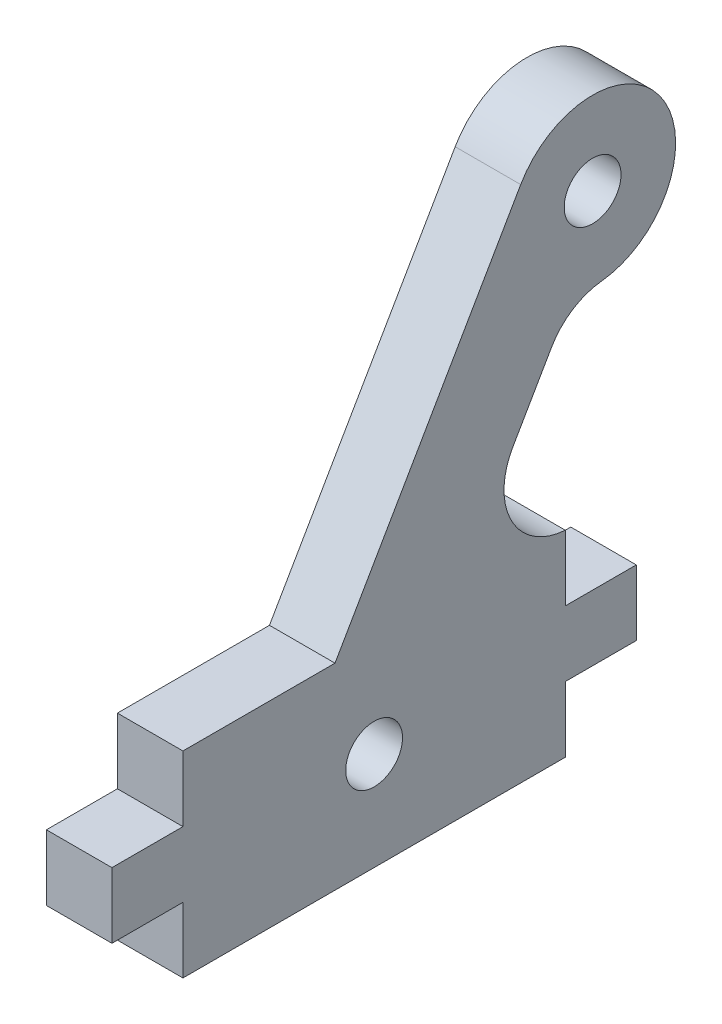
ISO-10303-21;
HEADER;
FILE_DESCRIPTION(('STEP AP214'),'2;1');
FILE_NAME('part.step','',(''),(''),'','','');
FILE_SCHEMA(('AUTOMOTIVE_DESIGN { 1 0 10303 214 1 1 1 1 }'));
ENDSEC;
DATA;
#1=APPLICATION_CONTEXT('core data for automotive mechanical design processes');
#2=APPLICATION_PROTOCOL_DEFINITION('international standard','automotive_design',2000,#1);
#3=PRODUCT_CONTEXT('',#1,'mechanical');
#4=PRODUCT('Part','Part','',(#3));
#5=PRODUCT_RELATED_PRODUCT_CATEGORY('part','',(#4));
#6=PRODUCT_DEFINITION_FORMATION('','',#4);
#7=PRODUCT_DEFINITION_CONTEXT('part definition',#1,'design');
#8=PRODUCT_DEFINITION('design','',#6,#7);
#9=PRODUCT_DEFINITION_SHAPE('','',#8);
#10=(LENGTH_UNIT() NAMED_UNIT(*) SI_UNIT(.MILLI.,.METRE.));
#11=(NAMED_UNIT(*) PLANE_ANGLE_UNIT() SI_UNIT($,.RADIAN.));
#12=(NAMED_UNIT(*) SI_UNIT($,.STERADIAN.) SOLID_ANGLE_UNIT());
#13=UNCERTAINTY_MEASURE_WITH_UNIT(LENGTH_MEASURE(1.E-05),#10,'distance_accuracy_value','');
#14=(GEOMETRIC_REPRESENTATION_CONTEXT(3) GLOBAL_UNCERTAINTY_ASSIGNED_CONTEXT((#13)) GLOBAL_UNIT_ASSIGNED_CONTEXT((#10,
#11,#12)) REPRESENTATION_CONTEXT('',''));
#15=CARTESIAN_POINT('',(0.,0.,0.));
#16=DIRECTION('',(0.,0.,1.));
#17=DIRECTION('',(1.,0.,0.));
#18=AXIS2_PLACEMENT_3D('',#15,#16,#17);
#19=CARTESIAN_POINT('',(3.,-0.499999999999998,-0.866025403784441));
#20=DIRECTION('',(0.,-0.499999999999998,-0.86602540378444));
#21=DIRECTION('',(0.,0.86602540378444,-0.499999999999998));
#22=AXIS2_PLACEMENT_3D('',#19,#20,#21);
#23=PLANE('',#22);
#24=DIRECTION('',(0.,-0.86602540378444,0.499999999999998));
#25=VECTOR('',#24,1.);
#26=CARTESIAN_POINT('',(0.,-0.499999999999998,-0.866025403784441));
#27=LINE('',#26,#25);
#28=CARTESIAN_POINT('',(0.,12.0581557157725,-8.1164799868109));
#29=VERTEX_POINT('',#28);
#30=CARTESIAN_POINT('',(0.,8.99363906105745,-6.34718047127507));
#31=VERTEX_POINT('',#30);
#32=EDGE_CURVE('E211',#29,#31,#27,.T.);
#33=ORIENTED_EDGE('',*,*,#32,.F.);
#34=DIRECTION('',(-1.,0.,0.));
#35=VECTOR('',#34,1.);
#36=CARTESIAN_POINT('',(3.,12.0581557157725,-8.1164799868109));
#37=LINE('',#36,#35);
#38=CARTESIAN_POINT('',(3.,12.0581557157725,-8.1164799868109));
#39=VERTEX_POINT('',#38);
#40=EDGE_CURVE('E56',#29,#39,#37,.F.);
#41=ORIENTED_EDGE('',*,*,#40,.T.);
#42=DIRECTION('',(0.,-0.86602540378444,0.499999999999998));
#43=VECTOR('',#42,1.);
#44=CARTESIAN_POINT('',(3.,-0.499999999999998,-0.866025403784441));
#45=LINE('',#44,#43);
#46=CARTESIAN_POINT('',(3.,8.99363906105745,-6.34718047127507));
#47=VERTEX_POINT('',#46);
#48=EDGE_CURVE('E165',#39,#47,#45,.T.);
#49=ORIENTED_EDGE('',*,*,#48,.T.);
#50=DIRECTION('',(1.,0.,0.));
#51=VECTOR('',#50,1.);
#52=CARTESIAN_POINT('',(0.,8.99363906105745,-6.34718047127507));
#53=LINE('',#52,#51);
#54=EDGE_CURVE('E277',#47,#31,#53,.F.);
#55=ORIENTED_EDGE('',*,*,#54,.T.);
#56=EDGE_LOOP('',(#33,#41,#49,#55));
#57=FACE_BOUND('',#56,.T.);
#58=ADVANCED_FACE('F36',(#57),#23,.T.);
#59=CARTESIAN_POINT('',(3.,17.3205080756888,-9.99999999999996));
#60=DIRECTION('',(-1.,0.,0.));
#61=DIRECTION('',(0.,0.,1.));
#62=AXIS2_PLACEMENT_3D('',#59,#60,#61);
#63=CYLINDRICAL_SURFACE('',#62,3.8);
#64=CARTESIAN_POINT('',(3.,17.3205080756888,-9.99999999999996));
#65=DIRECTION('',(1.,0.,0.));
#66=DIRECTION('',(0.,0.,-1.));
#67=AXIS2_PLACEMENT_3D('',#64,#65,#66);
#68=CIRCLE('',#67,3.8);
#69=CARTESIAN_POINT('',(3.,13.5415464627944,-10.3993108166212));
#70=VERTEX_POINT('',#69);
#71=CARTESIAN_POINT('',(3.,19.2205080756888,-6.70910346561908));
#72=VERTEX_POINT('',#71);
#73=EDGE_CURVE('E153',#70,#72,#68,.T.);
#74=ORIENTED_EDGE('',*,*,#73,.F.);
#75=DIRECTION('',(-1.,0.,0.));
#76=VECTOR('',#75,1.);
#77=CARTESIAN_POINT('',(3.,13.5415464627944,-10.3993108166212));
#78=LINE('',#77,#76);
#79=CARTESIAN_POINT('',(0.,13.5415464627944,-10.3993108166212));
#80=VERTEX_POINT('',#79);
#81=EDGE_CURVE('E175',#70,#80,#78,.T.);
#82=ORIENTED_EDGE('',*,*,#81,.T.);
#83=CARTESIAN_POINT('',(0.,17.3205080756888,-9.99999999999996));
#84=DIRECTION('',(1.,0.,0.));
#85=DIRECTION('',(0.,0.,-1.));
#86=AXIS2_PLACEMENT_3D('',#83,#84,#85);
#87=CIRCLE('',#86,3.8);
#88=CARTESIAN_POINT('',(0.,19.2205080756888,-6.70910346561908));
#89=VERTEX_POINT('',#88);
#90=EDGE_CURVE('E171',#80,#89,#87,.T.);
#91=ORIENTED_EDGE('',*,*,#90,.T.);
#92=DIRECTION('',(-1.,0.,0.));
#93=VECTOR('',#92,1.);
#94=CARTESIAN_POINT('',(3.,19.2205080756888,-6.70910346561908));
#95=LINE('',#94,#93);
#96=EDGE_CURVE('E168',#72,#89,#95,.T.);
#97=ORIENTED_EDGE('',*,*,#96,.F.);
#98=EDGE_LOOP('',(#74,#82,#91,#97));
#99=FACE_BOUND('',#98,.T.);
#100=ADVANCED_FACE('F169',(#99),#63,.T.);
#101=CARTESIAN_POINT('',(3.,1.89999999999999,3.29089653438087));
#102=DIRECTION('',(0.,-0.499999999999997,-0.86602540378444));
#103=DIRECTION('',(0.,0.86602540378444,-0.499999999999998));
#104=AXIS2_PLACEMENT_3D('',#101,#102,#103);
#105=PLANE('',#104);
#106=DIRECTION('',(0.,-0.86602540378444,0.499999999999998));
#107=VECTOR('',#106,1.);
#108=CARTESIAN_POINT('',(0.,1.89999999999999,3.29089653438087));
#109=LINE('',#108,#107);
#110=CARTESIAN_POINT('',(0.,4.5,1.78978583448785));
#111=VERTEX_POINT('',#110);
#112=EDGE_CURVE('E216',#89,#111,#109,.T.);
#113=ORIENTED_EDGE('',*,*,#112,.T.);
#114=DIRECTION('',(-1.,0.,0.));
#115=VECTOR('',#114,1.);
#116=CARTESIAN_POINT('',(3.,4.5,1.78978583448785));
#117=LINE('',#116,#115);
#118=CARTESIAN_POINT('',(3.,4.5,1.78978583448785));
#119=VERTEX_POINT('',#118);
#120=EDGE_CURVE('E176',#119,#111,#117,.T.);
#121=ORIENTED_EDGE('',*,*,#120,.F.);
#122=DIRECTION('',(0.,-0.86602540378444,0.499999999999998));
#123=VECTOR('',#122,1.);
#124=CARTESIAN_POINT('',(3.,1.89999999999999,3.29089653438087));
#125=LINE('',#124,#123);
#126=EDGE_CURVE('E158',#72,#119,#125,.T.);
#127=ORIENTED_EDGE('',*,*,#126,.F.);
#128=ORIENTED_EDGE('',*,*,#96,.T.);
#129=EDGE_LOOP('',(#113,#121,#127,#128));
#130=FACE_BOUND('',#129,.T.);
#131=ADVANCED_FACE('F178',(#130),#105,.F.);
#132=CARTESIAN_POINT('',(3.,4.5,0.));
#133=DIRECTION('',(0.,1.,0.));
#134=DIRECTION('',(0.,0.,1.));
#135=AXIS2_PLACEMENT_3D('',#132,#133,#134);
#136=PLANE('',#135);
#137=DIRECTION('',(0.,0.,-1.));
#138=VECTOR('',#137,1.);
#139=CARTESIAN_POINT('',(0.,4.5,0.));
#140=LINE('',#139,#138);
#141=CARTESIAN_POINT('',(0.,4.5,8.75));
#142=VERTEX_POINT('',#141);
#143=EDGE_CURVE('E218',#142,#111,#140,.T.);
#144=ORIENTED_EDGE('',*,*,#143,.F.);
#145=DIRECTION('',(-1.,0.,0.));
#146=VECTOR('',#145,1.);
#147=CARTESIAN_POINT('',(3.,4.5,8.75));
#148=LINE('',#147,#146);
#149=CARTESIAN_POINT('',(3.,4.5,8.75));
#150=VERTEX_POINT('',#149);
#151=EDGE_CURVE('E273',#150,#142,#148,.T.);
#152=ORIENTED_EDGE('',*,*,#151,.F.);
#153=DIRECTION('',(0.,0.,-1.));
#154=VECTOR('',#153,1.);
#155=CARTESIAN_POINT('',(3.,4.5,0.));
#156=LINE('',#155,#154);
#157=EDGE_CURVE('E180',#150,#119,#156,.T.);
#158=ORIENTED_EDGE('',*,*,#157,.T.);
#159=ORIENTED_EDGE('',*,*,#120,.T.);
#160=EDGE_LOOP('',(#144,#152,#158,#159));
#161=FACE_BOUND('',#160,.T.);
#162=ADVANCED_FACE('F341',(#161),#136,.T.);
#163=CARTESIAN_POINT('',(3.,0.,8.75));
#164=DIRECTION('',(0.,0.,1.));
#165=DIRECTION('',(1.,0.,0.));
#166=AXIS2_PLACEMENT_3D('',#163,#164,#165);
#167=PLANE('',#166);
#168=DIRECTION('',(0.,1.,0.));
#169=VECTOR('',#168,1.);
#170=CARTESIAN_POINT('',(0.,0.,8.75));
#171=LINE('',#170,#169);
#172=CARTESIAN_POINT('',(0.,1.5,8.75));
#173=VERTEX_POINT('',#172);
#174=EDGE_CURVE('E221',#173,#142,#171,.T.);
#175=ORIENTED_EDGE('',*,*,#174,.F.);
#176=DIRECTION('',(-1.,0.,0.));
#177=VECTOR('',#176,1.);
#178=CARTESIAN_POINT('',(3.,1.5,8.75));
#179=LINE('',#178,#177);
#180=CARTESIAN_POINT('',(3.,1.5,8.75));
#181=VERTEX_POINT('',#180);
#182=EDGE_CURVE('E271',#181,#173,#179,.T.);
#183=ORIENTED_EDGE('',*,*,#182,.F.);
#184=DIRECTION('',(0.,1.,0.));
#185=VECTOR('',#184,1.);
#186=CARTESIAN_POINT('',(3.,0.,8.75));
#187=LINE('',#186,#185);
#188=EDGE_CURVE('E182',#181,#150,#187,.T.);
#189=ORIENTED_EDGE('',*,*,#188,.T.);
#190=ORIENTED_EDGE('',*,*,#151,.T.);
#191=EDGE_LOOP('',(#175,#183,#189,#190));
#192=FACE_BOUND('',#191,.T.);
#193=ADVANCED_FACE('F345',(#192),#167,.T.);
#194=CARTESIAN_POINT('',(3.,1.5,0.));
#195=DIRECTION('',(0.,1.,0.));
#196=DIRECTION('',(0.,0.,1.));
#197=AXIS2_PLACEMENT_3D('',#194,#195,#196);
#198=PLANE('',#197);
#199=DIRECTION('',(0.,0.,-1.));
#200=VECTOR('',#199,1.);
#201=CARTESIAN_POINT('',(0.,1.5,0.));
#202=LINE('',#201,#200);
#203=CARTESIAN_POINT('',(0.,1.5,12.));
#204=VERTEX_POINT('',#203);
#205=EDGE_CURVE('E224',#204,#173,#202,.T.);
#206=ORIENTED_EDGE('',*,*,#205,.F.);
#207=DIRECTION('',(-1.,0.,0.));
#208=VECTOR('',#207,1.);
#209=CARTESIAN_POINT('',(3.,1.5,12.));
#210=LINE('',#209,#208);
#211=CARTESIAN_POINT('',(3.,1.5,12.));
#212=VERTEX_POINT('',#211);
#213=EDGE_CURVE('E269',#212,#204,#210,.T.);
#214=ORIENTED_EDGE('',*,*,#213,.F.);
#215=DIRECTION('',(0.,0.,-1.));
#216=VECTOR('',#215,1.);
#217=CARTESIAN_POINT('',(3.,1.5,0.));
#218=LINE('',#217,#216);
#219=EDGE_CURVE('E188',#212,#181,#218,.T.);
#220=ORIENTED_EDGE('',*,*,#219,.T.);
#221=ORIENTED_EDGE('',*,*,#182,.T.);
#222=EDGE_LOOP('',(#206,#214,#220,#221));
#223=FACE_BOUND('',#222,.T.);
#224=ADVANCED_FACE('F348',(#223),#198,.T.);
#225=CARTESIAN_POINT('',(3.,0.,12.));
#226=DIRECTION('',(0.,0.,1.));
#227=DIRECTION('',(1.,0.,0.));
#228=AXIS2_PLACEMENT_3D('',#225,#226,#227);
#229=PLANE('',#228);
#230=DIRECTION('',(0.,1.,0.));
#231=VECTOR('',#230,1.);
#232=CARTESIAN_POINT('',(0.,0.,12.));
#233=LINE('',#232,#231);
#234=CARTESIAN_POINT('',(0.,-1.5,12.));
#235=VERTEX_POINT('',#234);
#236=EDGE_CURVE('E227',#235,#204,#233,.T.);
#237=ORIENTED_EDGE('',*,*,#236,.F.);
#238=DIRECTION('',(-1.,0.,0.));
#239=VECTOR('',#238,1.);
#240=CARTESIAN_POINT('',(3.,-1.5,12.));
#241=LINE('',#240,#239);
#242=CARTESIAN_POINT('',(3.,-1.5,12.));
#243=VERTEX_POINT('',#242);
#244=EDGE_CURVE('E267',#243,#235,#241,.T.);
#245=ORIENTED_EDGE('',*,*,#244,.F.);
#246=DIRECTION('',(0.,1.,0.));
#247=VECTOR('',#246,1.);
#248=CARTESIAN_POINT('',(3.,0.,12.));
#249=LINE('',#248,#247);
#250=EDGE_CURVE('E191',#243,#212,#249,.T.);
#251=ORIENTED_EDGE('',*,*,#250,.T.);
#252=ORIENTED_EDGE('',*,*,#213,.T.);
#253=EDGE_LOOP('',(#237,#245,#251,#252));
#254=FACE_BOUND('',#253,.T.);
#255=ADVANCED_FACE('F352',(#254),#229,.T.);
#256=CARTESIAN_POINT('',(3.,-1.5,0.));
#257=DIRECTION('',(0.,1.,0.));
#258=DIRECTION('',(0.,0.,1.));
#259=AXIS2_PLACEMENT_3D('',#256,#257,#258);
#260=PLANE('',#259);
#261=DIRECTION('',(0.,0.,-1.));
#262=VECTOR('',#261,1.);
#263=CARTESIAN_POINT('',(0.,-1.5,0.));
#264=LINE('',#263,#262);
#265=CARTESIAN_POINT('',(0.,-1.5,8.75));
#266=VERTEX_POINT('',#265);
#267=EDGE_CURVE('E231',#235,#266,#264,.T.);
#268=ORIENTED_EDGE('',*,*,#267,.T.);
#269=DIRECTION('',(-1.,0.,0.));
#270=VECTOR('',#269,1.);
#271=CARTESIAN_POINT('',(3.,-1.5,8.75));
#272=LINE('',#271,#270);
#273=CARTESIAN_POINT('',(3.,-1.5,8.75));
#274=VERTEX_POINT('',#273);
#275=EDGE_CURVE('E265',#274,#266,#272,.T.);
#276=ORIENTED_EDGE('',*,*,#275,.F.);
#277=DIRECTION('',(0.,0.,-1.));
#278=VECTOR('',#277,1.);
#279=CARTESIAN_POINT('',(3.,-1.5,0.));
#280=LINE('',#279,#278);
#281=EDGE_CURVE('E195',#243,#274,#280,.T.);
#282=ORIENTED_EDGE('',*,*,#281,.F.);
#283=ORIENTED_EDGE('',*,*,#244,.T.);
#284=EDGE_LOOP('',(#268,#276,#282,#283));
#285=FACE_BOUND('',#284,.T.);
#286=ADVANCED_FACE('F357',(#285),#260,.F.);
#287=CARTESIAN_POINT('',(3.,0.,8.75));
#288=DIRECTION('',(0.,0.,1.));
#289=DIRECTION('',(1.,0.,0.));
#290=AXIS2_PLACEMENT_3D('',#287,#288,#289);
#291=PLANE('',#290);
#292=DIRECTION('',(0.,1.,0.));
#293=VECTOR('',#292,1.);
#294=CARTESIAN_POINT('',(0.,0.,8.75));
#295=LINE('',#294,#293);
#296=CARTESIAN_POINT('',(0.,-4.5,8.75));
#297=VERTEX_POINT('',#296);
#298=EDGE_CURVE('E234',#297,#266,#295,.T.);
#299=ORIENTED_EDGE('',*,*,#298,.F.);
#300=DIRECTION('',(-1.,0.,0.));
#301=VECTOR('',#300,1.);
#302=CARTESIAN_POINT('',(3.,-4.5,8.75));
#303=LINE('',#302,#301);
#304=CARTESIAN_POINT('',(3.,-4.5,8.75));
#305=VERTEX_POINT('',#304);
#306=EDGE_CURVE('E263',#305,#297,#303,.T.);
#307=ORIENTED_EDGE('',*,*,#306,.F.);
#308=DIRECTION('',(0.,1.,0.));
#309=VECTOR('',#308,1.);
#310=CARTESIAN_POINT('',(3.,0.,8.75));
#311=LINE('',#310,#309);
#312=EDGE_CURVE('E197',#305,#274,#311,.T.);
#313=ORIENTED_EDGE('',*,*,#312,.T.);
#314=ORIENTED_EDGE('',*,*,#275,.T.);
#315=EDGE_LOOP('',(#299,#307,#313,#314));
#316=FACE_BOUND('',#315,.T.);
#317=ADVANCED_FACE('F363',(#316),#291,.T.);
#318=CARTESIAN_POINT('',(3.,-4.5,0.));
#319=DIRECTION('',(0.,1.,0.));
#320=DIRECTION('',(0.,0.,1.));
#321=AXIS2_PLACEMENT_3D('',#318,#319,#320);
#322=PLANE('',#321);
#323=DIRECTION('',(0.,0.,-1.));
#324=VECTOR('',#323,1.);
#325=CARTESIAN_POINT('',(0.,-4.5,0.));
#326=LINE('',#325,#324);
#327=CARTESIAN_POINT('',(0.,-4.5,-8.75));
#328=VERTEX_POINT('',#327);
#329=EDGE_CURVE('E238',#297,#328,#326,.T.);
#330=ORIENTED_EDGE('',*,*,#329,.T.);
#331=DIRECTION('',(-1.,0.,0.));
#332=VECTOR('',#331,1.);
#333=CARTESIAN_POINT('',(3.,-4.5,-8.75));
#334=LINE('',#333,#332);
#335=CARTESIAN_POINT('',(3.,-4.5,-8.75));
#336=VERTEX_POINT('',#335);
#337=EDGE_CURVE('E260',#336,#328,#334,.T.);
#338=ORIENTED_EDGE('',*,*,#337,.F.);
#339=DIRECTION('',(0.,0.,-1.));
#340=VECTOR('',#339,1.);
#341=CARTESIAN_POINT('',(3.,-4.5,0.));
#342=LINE('',#341,#340);
#343=EDGE_CURVE('E201',#305,#336,#342,.T.);
#344=ORIENTED_EDGE('',*,*,#343,.F.);
#345=ORIENTED_EDGE('',*,*,#306,.T.);
#346=EDGE_LOOP('',(#330,#338,#344,#345));
#347=FACE_BOUND('',#346,.T.);
#348=ADVANCED_FACE('F366',(#347),#322,.F.);
#349=CARTESIAN_POINT('',(3.,0.,-8.75));
#350=DIRECTION('',(0.,0.,1.));
#351=DIRECTION('',(1.,0.,0.));
#352=AXIS2_PLACEMENT_3D('',#349,#350,#351);
#353=PLANE('',#352);
#354=DIRECTION('',(0.,1.,0.));
#355=VECTOR('',#354,1.);
#356=CARTESIAN_POINT('',(0.,0.,-8.75));
#357=LINE('',#356,#355);
#358=CARTESIAN_POINT('',(0.,-1.5,-8.75));
#359=VERTEX_POINT('',#358);
#360=EDGE_CURVE('E240',#328,#359,#357,.T.);
#361=ORIENTED_EDGE('',*,*,#360,.T.);
#362=DIRECTION('',(-1.,0.,0.));
#363=VECTOR('',#362,1.);
#364=CARTESIAN_POINT('',(3.,-1.5,-8.75));
#365=LINE('',#364,#363);
#366=CARTESIAN_POINT('',(3.,-1.5,-8.75));
#367=VERTEX_POINT('',#366);
#368=EDGE_CURVE('E257',#367,#359,#365,.T.);
#369=ORIENTED_EDGE('',*,*,#368,.F.);
#370=DIRECTION('',(0.,1.,0.));
#371=VECTOR('',#370,1.);
#372=CARTESIAN_POINT('',(3.,0.,-8.75));
#373=LINE('',#372,#371);
#374=EDGE_CURVE('E203',#336,#367,#373,.T.);
#375=ORIENTED_EDGE('',*,*,#374,.F.);
#376=ORIENTED_EDGE('',*,*,#337,.T.);
#377=EDGE_LOOP('',(#361,#369,#375,#376));
#378=FACE_BOUND('',#377,.T.);
#379=ADVANCED_FACE('F371',(#378),#353,.F.);
#380=CARTESIAN_POINT('',(0.,-1.5,-12.));
#381=VERTEX_POINT('',#380);
#382=EDGE_CURVE('E235',#359,#381,#264,.T.);
#383=ORIENTED_EDGE('',*,*,#382,.T.);
#384=DIRECTION('',(-1.,0.,0.));
#385=VECTOR('',#384,1.);
#386=CARTESIAN_POINT('',(3.,-1.5,-12.));
#387=LINE('',#386,#385);
#388=CARTESIAN_POINT('',(3.,-1.5,-12.));
#389=VERTEX_POINT('',#388);
#390=EDGE_CURVE('E254',#389,#381,#387,.T.);
#391=ORIENTED_EDGE('',*,*,#390,.F.);
#392=EDGE_CURVE('E198',#367,#389,#280,.T.);
#393=ORIENTED_EDGE('',*,*,#392,.F.);
#394=ORIENTED_EDGE('',*,*,#368,.T.);
#395=EDGE_LOOP('',(#383,#391,#393,#394));
#396=FACE_BOUND('',#395,.T.);
#397=ADVANCED_FACE('F378',(#396),#260,.F.);
#398=CARTESIAN_POINT('',(3.,0.,-12.));
#399=DIRECTION('',(0.,0.,1.));
#400=DIRECTION('',(1.,0.,0.));
#401=AXIS2_PLACEMENT_3D('',#398,#399,#400);
#402=PLANE('',#401);
#403=DIRECTION('',(0.,1.,0.));
#404=VECTOR('',#403,1.);
#405=CARTESIAN_POINT('',(0.,0.,-12.));
#406=LINE('',#405,#404);
#407=CARTESIAN_POINT('',(0.,1.5,-12.));
#408=VERTEX_POINT('',#407);
#409=EDGE_CURVE('E242',#381,#408,#406,.T.);
#410=ORIENTED_EDGE('',*,*,#409,.T.);
#411=DIRECTION('',(-1.,0.,0.));
#412=VECTOR('',#411,1.);
#413=CARTESIAN_POINT('',(3.,1.5,-12.));
#414=LINE('',#413,#412);
#415=CARTESIAN_POINT('',(3.,1.5,-12.));
#416=VERTEX_POINT('',#415);
#417=EDGE_CURVE('E252',#416,#408,#414,.T.);
#418=ORIENTED_EDGE('',*,*,#417,.F.);
#419=DIRECTION('',(0.,1.,0.));
#420=VECTOR('',#419,1.);
#421=CARTESIAN_POINT('',(3.,0.,-12.));
#422=LINE('',#421,#420);
#423=EDGE_CURVE('E205',#389,#416,#422,.T.);
#424=ORIENTED_EDGE('',*,*,#423,.F.);
#425=ORIENTED_EDGE('',*,*,#390,.T.);
#426=EDGE_LOOP('',(#410,#418,#424,#425));
#427=FACE_BOUND('',#426,.T.);
#428=ADVANCED_FACE('F382',(#427),#402,.F.);
#429=CARTESIAN_POINT('',(0.,1.5,-8.75));
#430=VERTEX_POINT('',#429);
#431=EDGE_CURVE('E228',#430,#408,#202,.T.);
#432=ORIENTED_EDGE('',*,*,#431,.F.);
#433=DIRECTION('',(-1.,0.,0.));
#434=VECTOR('',#433,1.);
#435=CARTESIAN_POINT('',(3.,1.5,-8.75));
#436=LINE('',#435,#434);
#437=CARTESIAN_POINT('',(3.,1.5,-8.75));
#438=VERTEX_POINT('',#437);
#439=EDGE_CURVE('E250',#438,#430,#436,.T.);
#440=ORIENTED_EDGE('',*,*,#439,.F.);
#441=EDGE_CURVE('E192',#438,#416,#218,.T.);
#442=ORIENTED_EDGE('',*,*,#441,.T.);
#443=ORIENTED_EDGE('',*,*,#417,.T.);
#444=EDGE_LOOP('',(#432,#440,#442,#443));
#445=FACE_BOUND('',#444,.T.);
#446=ADVANCED_FACE('F385',(#445),#198,.T.);
#447=CARTESIAN_POINT('',(3.,0.,-8.75));
#448=DIRECTION('',(0.,0.,-1.));
#449=DIRECTION('',(-1.,0.,0.));
#450=AXIS2_PLACEMENT_3D('',#447,#448,#449);
#451=PLANE('',#450);
#452=DIRECTION('',(0.,-1.,0.));
#453=VECTOR('',#452,1.);
#454=CARTESIAN_POINT('',(0.,0.,-8.75));
#455=LINE('',#454,#453);
#456=CARTESIAN_POINT('',(0.,4.5,-8.75));
#457=VERTEX_POINT('',#456);
#458=EDGE_CURVE('E245',#457,#430,#455,.T.);
#459=ORIENTED_EDGE('',*,*,#458,.F.);
#460=DIRECTION('',(-1.,0.,0.));
#461=VECTOR('',#460,1.);
#462=CARTESIAN_POINT('',(3.,4.5,-8.75));
#463=LINE('',#462,#461);
#464=CARTESIAN_POINT('',(3.,4.5,-8.75));
#465=VERTEX_POINT('',#464);
#466=EDGE_CURVE('E210',#465,#457,#463,.T.);
#467=ORIENTED_EDGE('',*,*,#466,.F.);
#468=DIRECTION('',(0.,-1.,0.));
#469=VECTOR('',#468,1.);
#470=CARTESIAN_POINT('',(3.,0.,-8.75));
#471=LINE('',#470,#469);
#472=EDGE_CURVE('E207',#465,#438,#471,.T.);
#473=ORIENTED_EDGE('',*,*,#472,.T.);
#474=ORIENTED_EDGE('',*,*,#439,.T.);
#475=EDGE_LOOP('',(#459,#467,#473,#474));
#476=FACE_BOUND('',#475,.T.);
#477=ADVANCED_FACE('F290',(#476),#451,.T.);
#478=CARTESIAN_POINT('',(3.,0.,0.));
#479=DIRECTION('',(1.,0.,0.));
#480=DIRECTION('',(0.,0.,-1.));
#481=AXIS2_PLACEMENT_3D('',#478,#479,#480);
#482=PLANE('',#481);
#483=CARTESIAN_POINT('',(3.,0.,0.));
#484=DIRECTION('',(1.,0.,0.));
#485=DIRECTION('',(0.,0.,-1.));
#486=AXIS2_PLACEMENT_3D('',#483,#484,#485);
#487=CIRCLE('',#486,1.3);
#488=CARTESIAN_POINT('',(3.,0.,-1.3));
#489=VERTEX_POINT('',#488);
#490=EDGE_CURVE('E301',#489,#489,#487,.T.);
#491=ORIENTED_EDGE('',*,*,#490,.F.);
#492=EDGE_LOOP('',(#491));
#493=FACE_BOUND('',#492,.T.);
#494=CARTESIAN_POINT('',(3.,17.3205080756888,-9.99999999999996));
#495=DIRECTION('',(1.,0.,0.));
#496=DIRECTION('',(0.,0.,-1.));
#497=AXIS2_PLACEMENT_3D('',#494,#495,#496);
#498=CIRCLE('',#497,1.3);
#499=CARTESIAN_POINT('',(3.,17.3205080756888,-11.3));
#500=VERTEX_POINT('',#499);
#501=EDGE_CURVE('E295',#500,#500,#498,.T.);
#502=ORIENTED_EDGE('',*,*,#501,.F.);
#503=EDGE_LOOP('',(#502));
#504=FACE_BOUND('',#503,.T.);
#505=ORIENTED_EDGE('',*,*,#48,.F.);
#506=CARTESIAN_POINT('',(3.,10.5581557157725,-10.7145561981642));
#507=DIRECTION('',(1.,0.,0.));
#508=DIRECTION('',(0.,0.,-1.));
#509=AXIS2_PLACEMENT_3D('',#506,#507,#508);
#510=CIRCLE('',#509,3.);
#511=EDGE_CURVE('E161',#39,#70,#510,.F.);
#512=ORIENTED_EDGE('',*,*,#511,.T.);
#513=ORIENTED_EDGE('',*,*,#73,.T.);
#514=ORIENTED_EDGE('',*,*,#126,.T.);
#515=ORIENTED_EDGE('',*,*,#157,.F.);
#516=ORIENTED_EDGE('',*,*,#188,.F.);
#517=ORIENTED_EDGE('',*,*,#219,.F.);
#518=ORIENTED_EDGE('',*,*,#250,.F.);
#519=ORIENTED_EDGE('',*,*,#281,.T.);
#520=ORIENTED_EDGE('',*,*,#312,.F.);
#521=ORIENTED_EDGE('',*,*,#343,.T.);
#522=ORIENTED_EDGE('',*,*,#374,.T.);
#523=ORIENTED_EDGE('',*,*,#392,.T.);
#524=ORIENTED_EDGE('',*,*,#423,.T.);
#525=ORIENTED_EDGE('',*,*,#441,.F.);
#526=ORIENTED_EDGE('',*,*,#472,.F.);
#527=CARTESIAN_POINT('',(3.,7.49363906105746,-8.94525668262839));
#528=DIRECTION('',(1.,0.,0.));
#529=DIRECTION('',(0.,0.,-1.));
#530=AXIS2_PLACEMENT_3D('',#527,#528,#529);
#531=CIRCLE('',#530,3.);
#532=EDGE_CURVE('E11',#465,#47,#531,.F.);
#533=ORIENTED_EDGE('',*,*,#532,.T.);
#534=EDGE_LOOP('',(#505,#512,#513,#514,#515,#516,#517,#518,#519,#520,#521,#522,#523,#524,#525,
#526,#533));
#535=FACE_BOUND('',#534,.T.);
#536=ADVANCED_FACE('F155',(#493,#504,#535),#482,.T.);
#537=CARTESIAN_POINT('',(0.,0.,0.));
#538=DIRECTION('',(1.,0.,0.));
#539=DIRECTION('',(0.,0.,-1.));
#540=AXIS2_PLACEMENT_3D('',#537,#538,#539);
#541=PLANE('',#540);
#542=CARTESIAN_POINT('',(0.,0.,0.));
#543=DIRECTION('',(1.,0.,0.));
#544=DIRECTION('',(0.,0.,-1.));
#545=AXIS2_PLACEMENT_3D('',#542,#543,#544);
#546=CIRCLE('',#545,1.3);
#547=CARTESIAN_POINT('',(0.,0.,-1.3));
#548=VERTEX_POINT('',#547);
#549=EDGE_CURVE('E298',#548,#548,#546,.T.);
#550=ORIENTED_EDGE('',*,*,#549,.T.);
#551=EDGE_LOOP('',(#550));
#552=FACE_BOUND('',#551,.T.);
#553=CARTESIAN_POINT('',(0.,17.3205080756888,-9.99999999999996));
#554=DIRECTION('',(1.,0.,0.));
#555=DIRECTION('',(0.,0.,-1.));
#556=AXIS2_PLACEMENT_3D('',#553,#554,#555);
#557=CIRCLE('',#556,1.3);
#558=CARTESIAN_POINT('',(0.,17.3205080756888,-11.3));
#559=VERTEX_POINT('',#558);
#560=EDGE_CURVE('E214',#559,#559,#557,.T.);
#561=ORIENTED_EDGE('',*,*,#560,.T.);
#562=EDGE_LOOP('',(#561));
#563=FACE_BOUND('',#562,.T.);
#564=ORIENTED_EDGE('',*,*,#90,.F.);
#565=CARTESIAN_POINT('',(0.,10.5581557157725,-10.7145561981642));
#566=DIRECTION('',(1.,0.,0.));
#567=DIRECTION('',(0.,0.,-1.));
#568=AXIS2_PLACEMENT_3D('',#565,#566,#567);
#569=CIRCLE('',#568,3.);
#570=EDGE_CURVE('E281',#80,#29,#569,.T.);
#571=ORIENTED_EDGE('',*,*,#570,.T.);
#572=ORIENTED_EDGE('',*,*,#32,.T.);
#573=CARTESIAN_POINT('',(0.,7.49363906105746,-8.94525668262839));
#574=DIRECTION('',(1.,0.,0.));
#575=DIRECTION('',(0.,0.,-1.));
#576=AXIS2_PLACEMENT_3D('',#573,#574,#575);
#577=CIRCLE('',#576,3.);
#578=EDGE_CURVE('E44',#31,#457,#577,.T.);
#579=ORIENTED_EDGE('',*,*,#578,.T.);
#580=ORIENTED_EDGE('',*,*,#458,.T.);
#581=ORIENTED_EDGE('',*,*,#431,.T.);
#582=ORIENTED_EDGE('',*,*,#409,.F.);
#583=ORIENTED_EDGE('',*,*,#382,.F.);
#584=ORIENTED_EDGE('',*,*,#360,.F.);
#585=ORIENTED_EDGE('',*,*,#329,.F.);
#586=ORIENTED_EDGE('',*,*,#298,.T.);
#587=ORIENTED_EDGE('',*,*,#267,.F.);
#588=ORIENTED_EDGE('',*,*,#236,.T.);
#589=ORIENTED_EDGE('',*,*,#205,.T.);
#590=ORIENTED_EDGE('',*,*,#174,.T.);
#591=ORIENTED_EDGE('',*,*,#143,.T.);
#592=ORIENTED_EDGE('',*,*,#112,.F.);
#593=EDGE_LOOP('',(#564,#571,#572,#579,#580,#581,#582,#583,#584,#585,#586,#587,#588,#589,#590,
#591,#592));
#594=FACE_BOUND('',#593,.T.);
#595=ADVANCED_FACE('F285',(#552,#563,#594),#541,.F.);
#596=CARTESIAN_POINT('',(3.,17.3205080756888,-9.99999999999996));
#597=DIRECTION('',(1.,0.,0.));
#598=DIRECTION('',(0.,0.,-1.));
#599=AXIS2_PLACEMENT_3D('',#596,#597,#598);
#600=CYLINDRICAL_SURFACE('',#599,1.3);
#601=ORIENTED_EDGE('',*,*,#560,.F.);
#602=EDGE_LOOP('',(#601));
#603=FACE_BOUND('',#602,.T.);
#604=ORIENTED_EDGE('',*,*,#501,.T.);
#605=EDGE_LOOP('',(#604));
#606=FACE_BOUND('',#605,.T.);
#607=ADVANCED_FACE('F312',(#603,#606),#600,.F.);
#608=CARTESIAN_POINT('',(3.,0.,0.));
#609=DIRECTION('',(1.,0.,0.));
#610=DIRECTION('',(0.,0.,-1.));
#611=AXIS2_PLACEMENT_3D('',#608,#609,#610);
#612=CYLINDRICAL_SURFACE('',#611,1.3);
#613=ORIENTED_EDGE('',*,*,#549,.F.);
#614=EDGE_LOOP('',(#613));
#615=FACE_BOUND('',#614,.T.);
#616=ORIENTED_EDGE('',*,*,#490,.T.);
#617=EDGE_LOOP('',(#616));
#618=FACE_BOUND('',#617,.T.);
#619=ADVANCED_FACE('F305',(#615,#618),#612,.F.);
#620=CARTESIAN_POINT('',(3.,10.5581557157725,-10.7145561981642));
#621=DIRECTION('',(-1.,0.,0.));
#622=DIRECTION('',(0.,0.,1.));
#623=AXIS2_PLACEMENT_3D('',#620,#621,#622);
#624=CYLINDRICAL_SURFACE('',#623,3.);
#625=ORIENTED_EDGE('',*,*,#511,.F.);
#626=ORIENTED_EDGE('',*,*,#40,.F.);
#627=ORIENTED_EDGE('',*,*,#570,.F.);
#628=ORIENTED_EDGE('',*,*,#81,.F.);
#629=EDGE_LOOP('',(#625,#626,#627,#628));
#630=FACE_BOUND('',#629,.T.);
#631=ADVANCED_FACE('F320',(#630),#624,.F.);
#632=CARTESIAN_POINT('',(3.,7.49363906105746,-8.94525668262839));
#633=DIRECTION('',(-1.,0.,0.));
#634=DIRECTION('',(0.,0.,1.));
#635=AXIS2_PLACEMENT_3D('',#632,#633,#634);
#636=CYLINDRICAL_SURFACE('',#635,3.);
#637=ORIENTED_EDGE('',*,*,#532,.F.);
#638=ORIENTED_EDGE('',*,*,#466,.T.);
#639=ORIENTED_EDGE('',*,*,#578,.F.);
#640=ORIENTED_EDGE('',*,*,#54,.F.);
#641=EDGE_LOOP('',(#637,#638,#639,#640));
#642=FACE_BOUND('',#641,.T.);
#643=ADVANCED_FACE('F38',(#642),#636,.F.);
#644=CLOSED_SHELL('',(#58,#100,#131,#162,#193,#224,#255,#286,#317,#348,#379,#397,#428,#446,#477,
#536,#595,#607,#619,#631,#643));
#645=MANIFOLD_SOLID_BREP('B2',#644);
#646=ADVANCED_BREP_SHAPE_REPRESENTATION('',(#18,#645),#14);
#647=SHAPE_DEFINITION_REPRESENTATION(#9,#646);
ENDSEC;
END-ISO-10303-21;
